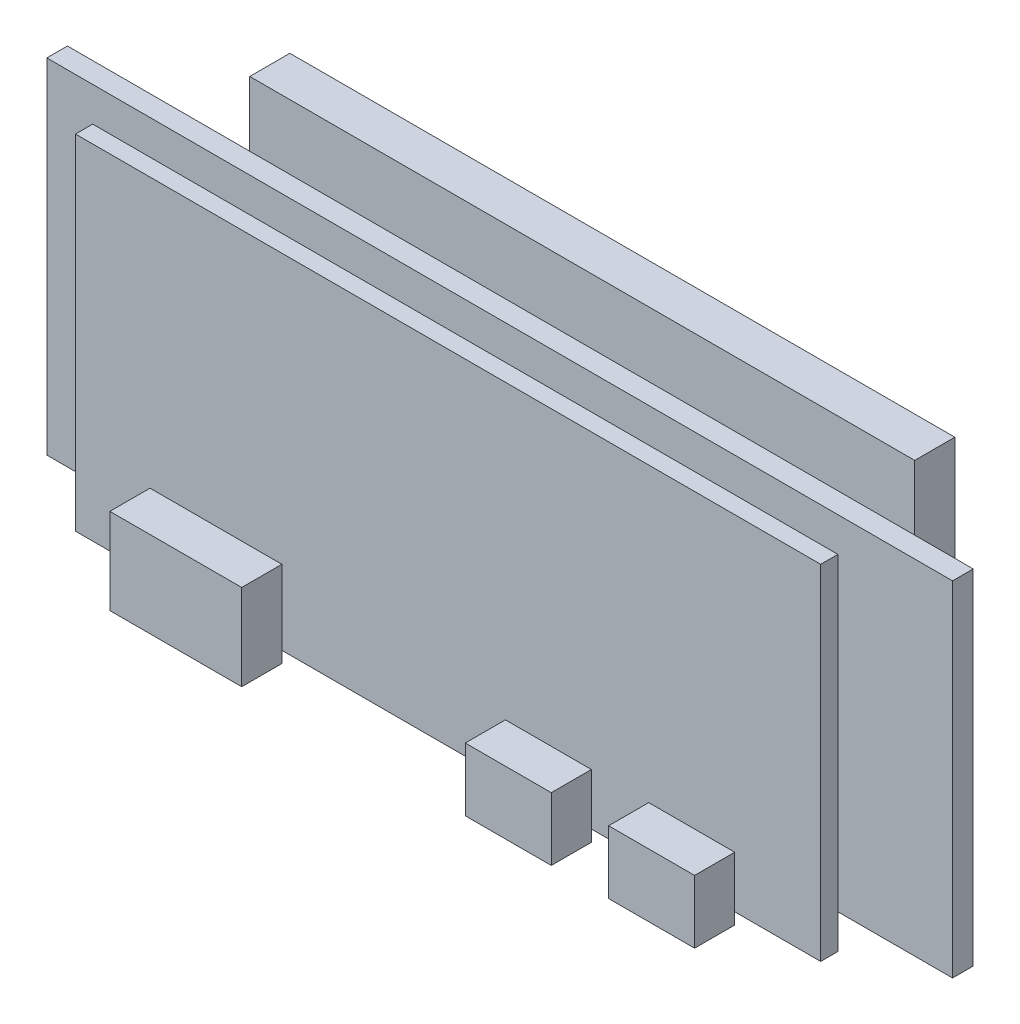
ISO-10303-21;
HEADER;
FILE_DESCRIPTION(('STEP AP214'),'2;1');
FILE_NAME('part.step','',(''),(''),'','','');
FILE_SCHEMA(('AUTOMOTIVE_DESIGN { 1 0 10303 214 1 1 1 1 }'));
ENDSEC;
DATA;
#1=APPLICATION_CONTEXT('core data for automotive mechanical design processes');
#2=APPLICATION_PROTOCOL_DEFINITION('international standard','automotive_design',2000,#1);
#3=PRODUCT_CONTEXT('',#1,'mechanical');
#4=PRODUCT('Part','Part','',(#3));
#5=PRODUCT_RELATED_PRODUCT_CATEGORY('part','',(#4));
#6=PRODUCT_DEFINITION_FORMATION('','',#4);
#7=PRODUCT_DEFINITION_CONTEXT('part definition',#1,'design');
#8=PRODUCT_DEFINITION('design','',#6,#7);
#9=PRODUCT_DEFINITION_SHAPE('','',#8);
#10=(LENGTH_UNIT() NAMED_UNIT(*) SI_UNIT(.MILLI.,.METRE.));
#11=(NAMED_UNIT(*) PLANE_ANGLE_UNIT() SI_UNIT($,.RADIAN.));
#12=(NAMED_UNIT(*) SI_UNIT($,.STERADIAN.) SOLID_ANGLE_UNIT());
#13=UNCERTAINTY_MEASURE_WITH_UNIT(LENGTH_MEASURE(1.E-05),#10,'distance_accuracy_value','');
#14=(GEOMETRIC_REPRESENTATION_CONTEXT(3) GLOBAL_UNCERTAINTY_ASSIGNED_CONTEXT((#13)) GLOBAL_UNIT_ASSIGNED_CONTEXT((#10,
#11,#12)) REPRESENTATION_CONTEXT('',''));
#15=CARTESIAN_POINT('',(0.,0.,0.));
#16=DIRECTION('',(0.,0.,1.));
#17=DIRECTION('',(1.,0.,0.));
#18=AXIS2_PLACEMENT_3D('',#15,#16,#17);
#19=CARTESIAN_POINT('',(0.,0.,15.2));
#20=DIRECTION('',(0.,0.,-1.));
#21=DIRECTION('',(-1.,0.,0.));
#22=AXIS2_PLACEMENT_3D('',#19,#20,#21);
#23=PLANE('',#22);
#24=DIRECTION('',(0.,-1.,0.));
#25=VECTOR('',#24,1.);
#26=CARTESIAN_POINT('',(5.,-10.5,15.2));
#27=LINE('',#26,#25);
#28=CARTESIAN_POINT('',(5.,-10.5,15.2));
#29=VERTEX_POINT('',#28);
#30=CARTESIAN_POINT('',(5.,-15.,15.2));
#31=VERTEX_POINT('',#30);
#32=EDGE_CURVE('E58',#29,#31,#27,.T.);
#33=ORIENTED_EDGE('',*,*,#32,.F.);
#34=DIRECTION('',(-1.,0.,0.));
#35=VECTOR('',#34,1.);
#36=CARTESIAN_POINT('',(5.,-10.5,15.2));
#37=LINE('',#36,#35);
#38=CARTESIAN_POINT('',(12.5,-10.5,15.2));
#39=VERTEX_POINT('',#38);
#40=EDGE_CURVE('E243',#39,#29,#37,.T.);
#41=ORIENTED_EDGE('',*,*,#40,.F.);
#42=DIRECTION('',(0.,1.,0.));
#43=VECTOR('',#42,1.);
#44=CARTESIAN_POINT('',(12.5,-10.5,15.2));
#45=LINE('',#44,#43);
#46=CARTESIAN_POINT('',(12.5,-15.,15.2));
#47=VERTEX_POINT('',#46);
#48=EDGE_CURVE('E890',#47,#39,#45,.T.);
#49=ORIENTED_EDGE('',*,*,#48,.F.);
#50=DIRECTION('',(-1.,0.,0.));
#51=VECTOR('',#50,1.);
#52=CARTESIAN_POINT('',(32.5,-15.,15.2));
#53=LINE('',#52,#51);
#54=CARTESIAN_POINT('',(17.5,-15.,15.2));
#55=VERTEX_POINT('',#54);
#56=EDGE_CURVE('E887',#55,#47,#53,.T.);
#57=ORIENTED_EDGE('',*,*,#56,.F.);
#58=DIRECTION('',(0.,-1.,0.));
#59=VECTOR('',#58,1.);
#60=CARTESIAN_POINT('',(17.5,-10.5,15.2));
#61=LINE('',#60,#59);
#62=CARTESIAN_POINT('',(17.5,-10.5,15.2));
#63=VERTEX_POINT('',#62);
#64=EDGE_CURVE('E66',#63,#55,#61,.T.);
#65=ORIENTED_EDGE('',*,*,#64,.F.);
#66=DIRECTION('',(-1.,0.,0.));
#67=VECTOR('',#66,1.);
#68=CARTESIAN_POINT('',(25.,-10.5,15.2));
#69=LINE('',#68,#67);
#70=CARTESIAN_POINT('',(25.,-10.5,15.2));
#71=VERTEX_POINT('',#70);
#72=EDGE_CURVE('E276',#71,#63,#69,.T.);
#73=ORIENTED_EDGE('',*,*,#72,.F.);
#74=DIRECTION('',(0.,1.,0.));
#75=VECTOR('',#74,1.);
#76=CARTESIAN_POINT('',(25.,-10.5,15.2));
#77=LINE('',#76,#75);
#78=CARTESIAN_POINT('',(25.,-15.,15.2));
#79=VERTEX_POINT('',#78);
#80=EDGE_CURVE('E249',#79,#71,#77,.T.);
#81=ORIENTED_EDGE('',*,*,#80,.F.);
#82=CARTESIAN_POINT('',(32.5,-15.,15.2));
#83=VERTEX_POINT('',#82);
#84=EDGE_CURVE('E348',#83,#79,#53,.T.);
#85=ORIENTED_EDGE('',*,*,#84,.F.);
#86=DIRECTION('',(0.,-1.,0.));
#87=VECTOR('',#86,1.);
#88=CARTESIAN_POINT('',(32.5,15.,15.2));
#89=LINE('',#88,#87);
#90=CARTESIAN_POINT('',(32.5,15.,15.2));
#91=VERTEX_POINT('',#90);
#92=EDGE_CURVE('E342',#91,#83,#89,.T.);
#93=ORIENTED_EDGE('',*,*,#92,.F.);
#94=DIRECTION('',(1.,0.,0.));
#95=VECTOR('',#94,1.);
#96=CARTESIAN_POINT('',(32.5,15.,15.2));
#97=LINE('',#96,#95);
#98=CARTESIAN_POINT('',(-32.5,15.,15.2));
#99=VERTEX_POINT('',#98);
#100=EDGE_CURVE('E359',#99,#91,#97,.T.);
#101=ORIENTED_EDGE('',*,*,#100,.F.);
#102=DIRECTION('',(0.,1.,0.));
#103=VECTOR('',#102,1.);
#104=CARTESIAN_POINT('',(-32.5,15.,15.2));
#105=LINE('',#104,#103);
#106=CARTESIAN_POINT('',(-32.5,-15.,15.2));
#107=VERTEX_POINT('',#106);
#108=EDGE_CURVE('E352',#107,#99,#105,.T.);
#109=ORIENTED_EDGE('',*,*,#108,.F.);
#110=CARTESIAN_POINT('',(-26.,-15.,15.2));
#111=VERTEX_POINT('',#110);
#112=EDGE_CURVE('E346',#111,#107,#53,.T.);
#113=ORIENTED_EDGE('',*,*,#112,.F.);
#114=DIRECTION('',(0.,-1.,0.));
#115=VECTOR('',#114,1.);
#116=CARTESIAN_POINT('',(-26.,-8.5,15.2));
#117=LINE('',#116,#115);
#118=CARTESIAN_POINT('',(-26.,-8.5,15.2));
#119=VERTEX_POINT('',#118);
#120=EDGE_CURVE('E314',#119,#111,#117,.T.);
#121=ORIENTED_EDGE('',*,*,#120,.F.);
#122=DIRECTION('',(-1.,0.,0.));
#123=VECTOR('',#122,1.);
#124=CARTESIAN_POINT('',(-26.,-8.5,15.2));
#125=LINE('',#124,#123);
#126=CARTESIAN_POINT('',(-14.5,-8.5,15.2));
#127=VERTEX_POINT('',#126);
#128=EDGE_CURVE('E304',#127,#119,#125,.T.);
#129=ORIENTED_EDGE('',*,*,#128,.F.);
#130=DIRECTION('',(0.,1.,0.));
#131=VECTOR('',#130,1.);
#132=CARTESIAN_POINT('',(-14.5,-8.5,15.2));
#133=LINE('',#132,#131);
#134=CARTESIAN_POINT('',(-14.5,-15.,15.2));
#135=VERTEX_POINT('',#134);
#136=EDGE_CURVE('E11',#135,#127,#133,.T.);
#137=ORIENTED_EDGE('',*,*,#136,.F.);
#138=EDGE_CURVE('E354',#31,#135,#53,.T.);
#139=ORIENTED_EDGE('',*,*,#138,.F.);
#140=EDGE_LOOP('',(#33,#41,#49,#57,#65,#73,#81,#85,#93,#101,#109,#113,#121,#129,#137,#139));
#141=FACE_BOUND('',#140,.T.);
#142=ADVANCED_FACE('F39',(#141),#23,.F.);
#143=CARTESIAN_POINT('',(-29.,15.25,3.5));
#144=DIRECTION('',(1.,0.,0.));
#145=DIRECTION('',(0.,0.,-1.));
#146=AXIS2_PLACEMENT_3D('',#143,#144,#145);
#147=PLANE('',#146);
#148=DIRECTION('',(0.,-1.,0.));
#149=VECTOR('',#148,1.);
#150=CARTESIAN_POINT('',(-29.,15.25,0.));
#151=LINE('',#150,#149);
#152=CARTESIAN_POINT('',(-29.,15.25,0.));
#153=VERTEX_POINT('',#152);
#154=CARTESIAN_POINT('',(-29.,-15.25,0.));
#155=VERTEX_POINT('',#154);
#156=EDGE_CURVE('E443',#153,#155,#151,.T.);
#157=ORIENTED_EDGE('',*,*,#156,.T.);
#158=DIRECTION('',(0.,0.,-1.));
#159=VECTOR('',#158,1.);
#160=CARTESIAN_POINT('',(-29.,-15.25,3.5));
#161=LINE('',#160,#159);
#162=CARTESIAN_POINT('',(-29.,-15.25,3.5));
#163=VERTEX_POINT('',#162);
#164=EDGE_CURVE('E43',#163,#155,#161,.T.);
#165=ORIENTED_EDGE('',*,*,#164,.F.);
#166=DIRECTION('',(0.,-1.,0.));
#167=VECTOR('',#166,1.);
#168=CARTESIAN_POINT('',(-29.,15.25,3.5));
#169=LINE('',#168,#167);
#170=CARTESIAN_POINT('',(-29.,15.25,3.5));
#171=VERTEX_POINT('',#170);
#172=EDGE_CURVE('E447',#171,#163,#169,.T.);
#173=ORIENTED_EDGE('',*,*,#172,.F.);
#174=DIRECTION('',(0.,0.,-1.));
#175=VECTOR('',#174,1.);
#176=CARTESIAN_POINT('',(-29.,15.25,3.5));
#177=LINE('',#176,#175);
#178=EDGE_CURVE('E461',#171,#153,#177,.T.);
#179=ORIENTED_EDGE('',*,*,#178,.T.);
#180=EDGE_LOOP('',(#157,#165,#173,#179));
#181=FACE_BOUND('',#180,.T.);
#182=ADVANCED_FACE('F41',(#181),#147,.F.);
#183=CARTESIAN_POINT('',(-29.,-15.25,3.5));
#184=DIRECTION('',(0.,1.,0.));
#185=DIRECTION('',(0.,0.,1.));
#186=AXIS2_PLACEMENT_3D('',#183,#184,#185);
#187=PLANE('',#186);
#188=DIRECTION('',(1.,0.,0.));
#189=VECTOR('',#188,1.);
#190=CARTESIAN_POINT('',(-29.,-15.25,0.));
#191=LINE('',#190,#189);
#192=CARTESIAN_POINT('',(29.,-15.25,0.));
#193=VERTEX_POINT('',#192);
#194=EDGE_CURVE('E465',#155,#193,#191,.T.);
#195=ORIENTED_EDGE('',*,*,#194,.T.);
#196=DIRECTION('',(0.,0.,-1.));
#197=VECTOR('',#196,1.);
#198=CARTESIAN_POINT('',(29.,-15.25,3.5));
#199=LINE('',#198,#197);
#200=CARTESIAN_POINT('',(29.,-15.25,3.5));
#201=VERTEX_POINT('',#200);
#202=EDGE_CURVE('E479',#201,#193,#199,.T.);
#203=ORIENTED_EDGE('',*,*,#202,.F.);
#204=DIRECTION('',(1.,0.,0.));
#205=VECTOR('',#204,1.);
#206=CARTESIAN_POINT('',(-29.,-15.25,3.5));
#207=LINE('',#206,#205);
#208=EDGE_CURVE('E451',#163,#201,#207,.T.);
#209=ORIENTED_EDGE('',*,*,#208,.F.);
#210=ORIENTED_EDGE('',*,*,#164,.T.);
#211=EDGE_LOOP('',(#195,#203,#209,#210));
#212=FACE_BOUND('',#211,.T.);
#213=ADVANCED_FACE('F490',(#212),#187,.F.);
#214=CARTESIAN_POINT('',(29.,15.25,3.5));
#215=DIRECTION('',(-1.,0.,0.));
#216=DIRECTION('',(0.,0.,1.));
#217=AXIS2_PLACEMENT_3D('',#214,#215,#216);
#218=PLANE('',#217);
#219=DIRECTION('',(0.,1.,0.));
#220=VECTOR('',#219,1.);
#221=CARTESIAN_POINT('',(29.,15.25,0.));
#222=LINE('',#221,#220);
#223=CARTESIAN_POINT('',(29.,15.25,0.));
#224=VERTEX_POINT('',#223);
#225=EDGE_CURVE('E468',#193,#224,#222,.T.);
#226=ORIENTED_EDGE('',*,*,#225,.T.);
#227=DIRECTION('',(0.,0.,-1.));
#228=VECTOR('',#227,1.);
#229=CARTESIAN_POINT('',(29.,15.25,3.5));
#230=LINE('',#229,#228);
#231=CARTESIAN_POINT('',(29.,15.25,3.5));
#232=VERTEX_POINT('',#231);
#233=EDGE_CURVE('E476',#232,#224,#230,.T.);
#234=ORIENTED_EDGE('',*,*,#233,.F.);
#235=DIRECTION('',(0.,1.,0.));
#236=VECTOR('',#235,1.);
#237=CARTESIAN_POINT('',(29.,15.25,3.5));
#238=LINE('',#237,#236);
#239=EDGE_CURVE('E455',#201,#232,#238,.T.);
#240=ORIENTED_EDGE('',*,*,#239,.F.);
#241=ORIENTED_EDGE('',*,*,#202,.T.);
#242=EDGE_LOOP('',(#226,#234,#240,#241));
#243=FACE_BOUND('',#242,.T.);
#244=ADVANCED_FACE('F499',(#243),#218,.F.);
#245=CARTESIAN_POINT('',(-29.,15.25,3.5));
#246=DIRECTION('',(0.,-1.,0.));
#247=DIRECTION('',(0.,0.,-1.));
#248=AXIS2_PLACEMENT_3D('',#245,#246,#247);
#249=PLANE('',#248);
#250=DIRECTION('',(-1.,0.,0.));
#251=VECTOR('',#250,1.);
#252=CARTESIAN_POINT('',(-29.,15.25,0.));
#253=LINE('',#252,#251);
#254=EDGE_CURVE('E452',#224,#153,#253,.T.);
#255=ORIENTED_EDGE('',*,*,#254,.T.);
#256=ORIENTED_EDGE('',*,*,#178,.F.);
#257=DIRECTION('',(-1.,0.,0.));
#258=VECTOR('',#257,1.);
#259=CARTESIAN_POINT('',(-29.,15.25,3.5));
#260=LINE('',#259,#258);
#261=EDGE_CURVE('E458',#232,#171,#260,.T.);
#262=ORIENTED_EDGE('',*,*,#261,.F.);
#263=ORIENTED_EDGE('',*,*,#233,.T.);
#264=EDGE_LOOP('',(#255,#256,#262,#263));
#265=FACE_BOUND('',#264,.T.);
#266=ADVANCED_FACE('F502',(#265),#249,.F.);
#267=CARTESIAN_POINT('',(0.,0.,3.5));
#268=DIRECTION('',(0.,0.,1.));
#269=DIRECTION('',(1.,0.,0.));
#270=AXIS2_PLACEMENT_3D('',#267,#268,#269);
#271=PLANE('',#270);
#272=CARTESIAN_POINT('',(0.,0.,3.5));
#273=DIRECTION('',(0.,0.,1.));
#274=DIRECTION('',(1.,0.,0.));
#275=AXIS2_PLACEMENT_3D('',#272,#273,#274);
#276=CIRCLE('',#275,5.07777154293215);
#277=CARTESIAN_POINT('',(5.07777154293215,0.,3.5));
#278=VERTEX_POINT('',#277);
#279=EDGE_CURVE('E49',#278,#278,#276,.T.);
#280=ORIENTED_EDGE('',*,*,#279,.F.);
#281=EDGE_LOOP('',(#280));
#282=FACE_BOUND('',#281,.T.);
#283=ORIENTED_EDGE('',*,*,#172,.T.);
#284=ORIENTED_EDGE('',*,*,#208,.T.);
#285=ORIENTED_EDGE('',*,*,#239,.T.);
#286=ORIENTED_EDGE('',*,*,#261,.T.);
#287=EDGE_LOOP('',(#283,#284,#285,#286));
#288=FACE_BOUND('',#287,.T.);
#289=ADVANCED_FACE('F504',(#282,#288),#271,.T.);
#290=CARTESIAN_POINT('',(0.,0.,0.));
#291=DIRECTION('',(0.,0.,1.));
#292=DIRECTION('',(1.,0.,0.));
#293=AXIS2_PLACEMENT_3D('',#290,#291,#292);
#294=PLANE('',#293);
#295=ORIENTED_EDGE('',*,*,#156,.F.);
#296=ORIENTED_EDGE('',*,*,#254,.F.);
#297=ORIENTED_EDGE('',*,*,#225,.F.);
#298=ORIENTED_EDGE('',*,*,#194,.F.);
#299=EDGE_LOOP('',(#295,#296,#297,#298));
#300=FACE_BOUND('',#299,.T.);
#301=ADVANCED_FACE('F497',(#300),#294,.F.);
#302=CARTESIAN_POINT('',(0.,0.,9.4));
#303=DIRECTION('',(0.,0.,-1.));
#304=DIRECTION('',(-1.,0.,0.));
#305=AXIS2_PLACEMENT_3D('',#302,#303,#304);
#306=CYLINDRICAL_SURFACE('',#305,5.07777154293215);
#307=CARTESIAN_POINT('',(0.,0.,9.4));
#308=DIRECTION('',(0.,0.,1.));
#309=DIRECTION('',(1.,0.,0.));
#310=AXIS2_PLACEMENT_3D('',#307,#308,#309);
#311=CIRCLE('',#310,5.07777154293215);
#312=CARTESIAN_POINT('',(5.07777154293215,0.,9.4));
#313=VERTEX_POINT('',#312);
#314=EDGE_CURVE('E439',#313,#313,#311,.T.);
#315=ORIENTED_EDGE('',*,*,#314,.F.);
#316=EDGE_LOOP('',(#315));
#317=FACE_BOUND('',#316,.T.);
#318=ORIENTED_EDGE('',*,*,#279,.T.);
#319=EDGE_LOOP('',(#318));
#320=FACE_BOUND('',#319,.T.);
#321=ADVANCED_FACE('F512',(#317,#320),#306,.T.);
#322=CARTESIAN_POINT('',(-39.,15.5,11.2));
#323=DIRECTION('',(1.,0.,0.));
#324=DIRECTION('',(0.,0.,-1.));
#325=AXIS2_PLACEMENT_3D('',#322,#323,#324);
#326=PLANE('',#325);
#327=DIRECTION('',(0.,-1.,0.));
#328=VECTOR('',#327,1.);
#329=CARTESIAN_POINT('',(-39.,15.5,9.4));
#330=LINE('',#329,#328);
#331=CARTESIAN_POINT('',(-39.,15.5,9.4));
#332=VERTEX_POINT('',#331);
#333=CARTESIAN_POINT('',(-39.,-14.5,9.4));
#334=VERTEX_POINT('',#333);
#335=EDGE_CURVE('E397',#332,#334,#330,.T.);
#336=ORIENTED_EDGE('',*,*,#335,.T.);
#337=DIRECTION('',(0.,0.,-1.));
#338=VECTOR('',#337,1.);
#339=CARTESIAN_POINT('',(-39.,-14.5,11.2));
#340=LINE('',#339,#338);
#341=CARTESIAN_POINT('',(-39.,-14.5,11.2));
#342=VERTEX_POINT('',#341);
#343=EDGE_CURVE('E435',#342,#334,#340,.T.);
#344=ORIENTED_EDGE('',*,*,#343,.F.);
#345=DIRECTION('',(0.,-1.,0.));
#346=VECTOR('',#345,1.);
#347=CARTESIAN_POINT('',(-39.,15.5,11.2));
#348=LINE('',#347,#346);
#349=CARTESIAN_POINT('',(-39.,15.5,11.2));
#350=VERTEX_POINT('',#349);
#351=EDGE_CURVE('E398',#350,#342,#348,.T.);
#352=ORIENTED_EDGE('',*,*,#351,.F.);
#353=DIRECTION('',(0.,0.,-1.));
#354=VECTOR('',#353,1.);
#355=CARTESIAN_POINT('',(-39.,15.5,11.2));
#356=LINE('',#355,#354);
#357=EDGE_CURVE('E412',#350,#332,#356,.T.);
#358=ORIENTED_EDGE('',*,*,#357,.T.);
#359=EDGE_LOOP('',(#336,#344,#352,#358));
#360=FACE_BOUND('',#359,.T.);
#361=ADVANCED_FACE('F570',(#360),#326,.F.);
#362=CARTESIAN_POINT('',(-39.,-14.5,11.2));
#363=DIRECTION('',(0.,1.,0.));
#364=DIRECTION('',(0.,0.,1.));
#365=AXIS2_PLACEMENT_3D('',#362,#363,#364);
#366=PLANE('',#365);
#367=DIRECTION('',(1.,0.,0.));
#368=VECTOR('',#367,1.);
#369=CARTESIAN_POINT('',(-39.,-14.5,9.4));
#370=LINE('',#369,#368);
#371=CARTESIAN_POINT('',(40.,-14.5,9.4));
#372=VERTEX_POINT('',#371);
#373=EDGE_CURVE('E416',#334,#372,#370,.T.);
#374=ORIENTED_EDGE('',*,*,#373,.T.);
#375=DIRECTION('',(0.,0.,-1.));
#376=VECTOR('',#375,1.);
#377=CARTESIAN_POINT('',(40.,-14.5,11.2));
#378=LINE('',#377,#376);
#379=CARTESIAN_POINT('',(40.,-14.5,11.2));
#380=VERTEX_POINT('',#379);
#381=EDGE_CURVE('E431',#380,#372,#378,.T.);
#382=ORIENTED_EDGE('',*,*,#381,.F.);
#383=DIRECTION('',(1.,0.,0.));
#384=VECTOR('',#383,1.);
#385=CARTESIAN_POINT('',(-39.,-14.5,11.2));
#386=LINE('',#385,#384);
#387=EDGE_CURVE('E402',#342,#380,#386,.T.);
#388=ORIENTED_EDGE('',*,*,#387,.F.);
#389=ORIENTED_EDGE('',*,*,#343,.T.);
#390=EDGE_LOOP('',(#374,#382,#388,#389));
#391=FACE_BOUND('',#390,.T.);
#392=ADVANCED_FACE('F566',(#391),#366,.F.);
#393=CARTESIAN_POINT('',(40.,15.5,11.2));
#394=DIRECTION('',(-1.,0.,0.));
#395=DIRECTION('',(0.,0.,1.));
#396=AXIS2_PLACEMENT_3D('',#393,#394,#395);
#397=PLANE('',#396);
#398=DIRECTION('',(0.,1.,0.));
#399=VECTOR('',#398,1.);
#400=CARTESIAN_POINT('',(40.,15.5,9.4));
#401=LINE('',#400,#399);
#402=CARTESIAN_POINT('',(40.,15.5,9.4));
#403=VERTEX_POINT('',#402);
#404=EDGE_CURVE('E419',#372,#403,#401,.T.);
#405=ORIENTED_EDGE('',*,*,#404,.T.);
#406=DIRECTION('',(0.,0.,-1.));
#407=VECTOR('',#406,1.);
#408=CARTESIAN_POINT('',(40.,15.5,11.2));
#409=LINE('',#408,#407);
#410=CARTESIAN_POINT('',(40.,15.5,11.2));
#411=VERTEX_POINT('',#410);
#412=EDGE_CURVE('E427',#411,#403,#409,.T.);
#413=ORIENTED_EDGE('',*,*,#412,.F.);
#414=DIRECTION('',(0.,1.,0.));
#415=VECTOR('',#414,1.);
#416=CARTESIAN_POINT('',(40.,15.5,11.2));
#417=LINE('',#416,#415);
#418=EDGE_CURVE('E406',#380,#411,#417,.T.);
#419=ORIENTED_EDGE('',*,*,#418,.F.);
#420=ORIENTED_EDGE('',*,*,#381,.T.);
#421=EDGE_LOOP('',(#405,#413,#419,#420));
#422=FACE_BOUND('',#421,.T.);
#423=ADVANCED_FACE('F562',(#422),#397,.F.);
#424=CARTESIAN_POINT('',(-39.,15.5,11.2));
#425=DIRECTION('',(0.,-1.,0.));
#426=DIRECTION('',(0.,0.,-1.));
#427=AXIS2_PLACEMENT_3D('',#424,#425,#426);
#428=PLANE('',#427);
#429=DIRECTION('',(-1.,0.,0.));
#430=VECTOR('',#429,1.);
#431=CARTESIAN_POINT('',(-39.,15.5,9.4));
#432=LINE('',#431,#430);
#433=EDGE_CURVE('E403',#403,#332,#432,.T.);
#434=ORIENTED_EDGE('',*,*,#433,.T.);
#435=ORIENTED_EDGE('',*,*,#357,.F.);
#436=DIRECTION('',(-1.,0.,0.));
#437=VECTOR('',#436,1.);
#438=CARTESIAN_POINT('',(-39.,15.5,11.2));
#439=LINE('',#438,#437);
#440=EDGE_CURVE('E409',#411,#350,#439,.T.);
#441=ORIENTED_EDGE('',*,*,#440,.F.);
#442=ORIENTED_EDGE('',*,*,#412,.T.);
#443=EDGE_LOOP('',(#434,#435,#441,#442));
#444=FACE_BOUND('',#443,.T.);
#445=ADVANCED_FACE('F555',(#444),#428,.F.);
#446=CARTESIAN_POINT('',(0.,0.,11.2));
#447=DIRECTION('',(0.,0.,1.));
#448=DIRECTION('',(1.,0.,0.));
#449=AXIS2_PLACEMENT_3D('',#446,#447,#448);
#450=PLANE('',#449);
#451=CARTESIAN_POINT('',(0.,0.,11.2));
#452=DIRECTION('',(0.,0.,-1.));
#453=DIRECTION('',(-1.,0.,0.));
#454=AXIS2_PLACEMENT_3D('',#451,#452,#453);
#455=CIRCLE('',#454,7.56900947709878);
#456=CARTESIAN_POINT('',(-7.56900947709878,0.,11.2));
#457=VERTEX_POINT('',#456);
#458=EDGE_CURVE('E393',#457,#457,#455,.T.);
#459=ORIENTED_EDGE('',*,*,#458,.T.);
#460=EDGE_LOOP('',(#459));
#461=FACE_BOUND('',#460,.T.);
#462=ORIENTED_EDGE('',*,*,#351,.T.);
#463=ORIENTED_EDGE('',*,*,#387,.T.);
#464=ORIENTED_EDGE('',*,*,#418,.T.);
#465=ORIENTED_EDGE('',*,*,#440,.T.);
#466=EDGE_LOOP('',(#462,#463,#464,#465));
#467=FACE_BOUND('',#466,.T.);
#468=ADVANCED_FACE('F552',(#461,#467),#450,.T.);
#469=CARTESIAN_POINT('',(0.,0.,9.4));
#470=DIRECTION('',(0.,0.,1.));
#471=DIRECTION('',(1.,0.,0.));
#472=AXIS2_PLACEMENT_3D('',#469,#470,#471);
#473=PLANE('',#472);
#474=ORIENTED_EDGE('',*,*,#314,.T.);
#475=EDGE_LOOP('',(#474));
#476=FACE_BOUND('',#475,.T.);
#477=ORIENTED_EDGE('',*,*,#335,.F.);
#478=ORIENTED_EDGE('',*,*,#433,.F.);
#479=ORIENTED_EDGE('',*,*,#404,.F.);
#480=ORIENTED_EDGE('',*,*,#373,.F.);
#481=EDGE_LOOP('',(#477,#478,#479,#480));
#482=FACE_BOUND('',#481,.T.);
#483=ADVANCED_FACE('F550',(#476,#482),#473,.F.);
#484=CARTESIAN_POINT('',(0.,0.,13.7));
#485=DIRECTION('',(0.,0.,-1.));
#486=DIRECTION('',(-1.,0.,0.));
#487=AXIS2_PLACEMENT_3D('',#484,#485,#486);
#488=CYLINDRICAL_SURFACE('',#487,7.56900947709878);
#489=CARTESIAN_POINT('',(0.,0.,13.7));
#490=DIRECTION('',(0.,0.,-1.));
#491=DIRECTION('',(-1.,0.,0.));
#492=AXIS2_PLACEMENT_3D('',#489,#490,#491);
#493=CIRCLE('',#492,7.56900947709878);
#494=CARTESIAN_POINT('',(-7.56900947709878,0.,13.7));
#495=VERTEX_POINT('',#494);
#496=EDGE_CURVE('E381',#495,#495,#493,.T.);
#497=ORIENTED_EDGE('',*,*,#496,.T.);
#498=EDGE_LOOP('',(#497));
#499=FACE_BOUND('',#498,.T.);
#500=ORIENTED_EDGE('',*,*,#458,.F.);
#501=EDGE_LOOP('',(#500));
#502=FACE_BOUND('',#501,.T.);
#503=ADVANCED_FACE('F546',(#499,#502),#488,.T.);
#504=CARTESIAN_POINT('',(32.5,15.,15.2));
#505=DIRECTION('',(1.,0.,0.));
#506=DIRECTION('',(0.,0.,-1.));
#507=AXIS2_PLACEMENT_3D('',#504,#505,#506);
#508=PLANE('',#507);
#509=DIRECTION('',(0.,-1.,0.));
#510=VECTOR('',#509,1.);
#511=CARTESIAN_POINT('',(32.5,15.,13.7));
#512=LINE('',#511,#510);
#513=CARTESIAN_POINT('',(32.5,15.,13.7));
#514=VERTEX_POINT('',#513);
#515=CARTESIAN_POINT('',(32.5,-15.,13.7));
#516=VERTEX_POINT('',#515);
#517=EDGE_CURVE('E341',#514,#516,#512,.T.);
#518=ORIENTED_EDGE('',*,*,#517,.F.);
#519=DIRECTION('',(0.,0.,-1.));
#520=VECTOR('',#519,1.);
#521=CARTESIAN_POINT('',(32.5,15.,15.2));
#522=LINE('',#521,#520);
#523=EDGE_CURVE('E378',#91,#514,#522,.T.);
#524=ORIENTED_EDGE('',*,*,#523,.F.);
#525=ORIENTED_EDGE('',*,*,#92,.T.);
#526=DIRECTION('',(0.,0.,-1.));
#527=VECTOR('',#526,1.);
#528=CARTESIAN_POINT('',(32.5,-15.,15.2));
#529=LINE('',#528,#527);
#530=EDGE_CURVE('E363',#83,#516,#529,.T.);
#531=ORIENTED_EDGE('',*,*,#530,.T.);
#532=EDGE_LOOP('',(#518,#524,#525,#531));
#533=FACE_BOUND('',#532,.T.);
#534=ADVANCED_FACE('F536',(#533),#508,.T.);
#535=CARTESIAN_POINT('',(32.5,15.,15.2));
#536=DIRECTION('',(0.,1.,0.));
#537=DIRECTION('',(0.,0.,1.));
#538=AXIS2_PLACEMENT_3D('',#535,#536,#537);
#539=PLANE('',#538);
#540=DIRECTION('',(1.,0.,0.));
#541=VECTOR('',#540,1.);
#542=CARTESIAN_POINT('',(32.5,15.,13.7));
#543=LINE('',#542,#541);
#544=CARTESIAN_POINT('',(-32.5,15.,13.7));
#545=VERTEX_POINT('',#544);
#546=EDGE_CURVE('E347',#545,#514,#543,.T.);
#547=ORIENTED_EDGE('',*,*,#546,.F.);
#548=DIRECTION('',(0.,0.,-1.));
#549=VECTOR('',#548,1.);
#550=CARTESIAN_POINT('',(-32.5,15.,15.2));
#551=LINE('',#550,#549);
#552=EDGE_CURVE('E382',#99,#545,#551,.T.);
#553=ORIENTED_EDGE('',*,*,#552,.F.);
#554=ORIENTED_EDGE('',*,*,#100,.T.);
#555=ORIENTED_EDGE('',*,*,#523,.T.);
#556=EDGE_LOOP('',(#547,#553,#554,#555));
#557=FACE_BOUND('',#556,.T.);
#558=ADVANCED_FACE('F532',(#557),#539,.T.);
#559=CARTESIAN_POINT('',(-32.5,15.,15.2));
#560=DIRECTION('',(-1.,0.,0.));
#561=DIRECTION('',(0.,0.,1.));
#562=AXIS2_PLACEMENT_3D('',#559,#560,#561);
#563=PLANE('',#562);
#564=DIRECTION('',(0.,1.,0.));
#565=VECTOR('',#564,1.);
#566=CARTESIAN_POINT('',(-32.5,15.,13.7));
#567=LINE('',#566,#565);
#568=CARTESIAN_POINT('',(-32.5,-15.,13.7));
#569=VERTEX_POINT('',#568);
#570=EDGE_CURVE('E371',#569,#545,#567,.T.);
#571=ORIENTED_EDGE('',*,*,#570,.F.);
#572=DIRECTION('',(0.,0.,-1.));
#573=VECTOR('',#572,1.);
#574=CARTESIAN_POINT('',(-32.5,-15.,15.2));
#575=LINE('',#574,#573);
#576=EDGE_CURVE('E385',#107,#569,#575,.T.);
#577=ORIENTED_EDGE('',*,*,#576,.F.);
#578=ORIENTED_EDGE('',*,*,#108,.T.);
#579=ORIENTED_EDGE('',*,*,#552,.T.);
#580=EDGE_LOOP('',(#571,#577,#578,#579));
#581=FACE_BOUND('',#580,.T.);
#582=ADVANCED_FACE('F535',(#581),#563,.T.);
#583=CARTESIAN_POINT('',(32.5,-15.,15.2));
#584=DIRECTION('',(0.,-1.,0.));
#585=DIRECTION('',(0.,0.,-1.));
#586=AXIS2_PLACEMENT_3D('',#583,#584,#585);
#587=PLANE('',#586);
#588=DIRECTION('',(-1.,0.,0.));
#589=VECTOR('',#588,1.);
#590=CARTESIAN_POINT('',(32.5,-15.,13.7));
#591=LINE('',#590,#589);
#592=EDGE_CURVE('E367',#516,#569,#591,.T.);
#593=ORIENTED_EDGE('',*,*,#592,.F.);
#594=ORIENTED_EDGE('',*,*,#530,.F.);
#595=ORIENTED_EDGE('',*,*,#84,.T.);
#596=EDGE_CURVE('E353',#79,#55,#53,.T.);
#597=ORIENTED_EDGE('',*,*,#596,.T.);
#598=ORIENTED_EDGE('',*,*,#56,.T.);
#599=EDGE_CURVE('E881',#47,#31,#53,.T.);
#600=ORIENTED_EDGE('',*,*,#599,.T.);
#601=ORIENTED_EDGE('',*,*,#138,.T.);
#602=EDGE_CURVE('E355',#135,#111,#53,.T.);
#603=ORIENTED_EDGE('',*,*,#602,.T.);
#604=ORIENTED_EDGE('',*,*,#112,.T.);
#605=ORIENTED_EDGE('',*,*,#576,.T.);
#606=EDGE_LOOP('',(#593,#594,#595,#597,#598,#600,#601,#603,#604,#605));
#607=FACE_BOUND('',#606,.T.);
#608=ADVANCED_FACE('F530',(#607),#587,.T.);
#609=CARTESIAN_POINT('',(0.,0.,13.7));
#610=DIRECTION('',(0.,0.,-1.));
#611=DIRECTION('',(-1.,0.,0.));
#612=AXIS2_PLACEMENT_3D('',#609,#610,#611);
#613=PLANE('',#612);
#614=ORIENTED_EDGE('',*,*,#496,.F.);
#615=EDGE_LOOP('',(#614));
#616=FACE_BOUND('',#615,.T.);
#617=ORIENTED_EDGE('',*,*,#517,.T.);
#618=ORIENTED_EDGE('',*,*,#592,.T.);
#619=ORIENTED_EDGE('',*,*,#570,.T.);
#620=ORIENTED_EDGE('',*,*,#546,.T.);
#621=EDGE_LOOP('',(#617,#618,#619,#620));
#622=FACE_BOUND('',#621,.T.);
#623=ADVANCED_FACE('F527',(#616,#622),#613,.T.);
#624=CARTESIAN_POINT('',(-26.,-8.5,18.7));
#625=DIRECTION('',(1.,0.,0.));
#626=DIRECTION('',(0.,0.,-1.));
#627=AXIS2_PLACEMENT_3D('',#624,#625,#626);
#628=PLANE('',#627);
#629=ORIENTED_EDGE('',*,*,#120,.T.);
#630=CARTESIAN_POINT('',(-26.,-16.,15.2));
#631=VERTEX_POINT('',#630);
#632=EDGE_CURVE('E298',#111,#631,#117,.T.);
#633=ORIENTED_EDGE('',*,*,#632,.T.);
#634=DIRECTION('',(0.,0.,-1.));
#635=VECTOR('',#634,1.);
#636=CARTESIAN_POINT('',(-26.,-16.,18.7));
#637=LINE('',#636,#635);
#638=CARTESIAN_POINT('',(-26.,-16.,18.7));
#639=VERTEX_POINT('',#638);
#640=EDGE_CURVE('E337',#639,#631,#637,.T.);
#641=ORIENTED_EDGE('',*,*,#640,.F.);
#642=DIRECTION('',(0.,-1.,0.));
#643=VECTOR('',#642,1.);
#644=CARTESIAN_POINT('',(-26.,-8.5,18.7));
#645=LINE('',#644,#643);
#646=CARTESIAN_POINT('',(-26.,-8.5,18.7));
#647=VERTEX_POINT('',#646);
#648=EDGE_CURVE('E299',#647,#639,#645,.T.);
#649=ORIENTED_EDGE('',*,*,#648,.F.);
#650=DIRECTION('',(0.,0.,-1.));
#651=VECTOR('',#650,1.);
#652=CARTESIAN_POINT('',(-26.,-8.5,18.7));
#653=LINE('',#652,#651);
#654=EDGE_CURVE('E313',#647,#119,#653,.T.);
#655=ORIENTED_EDGE('',*,*,#654,.T.);
#656=EDGE_LOOP('',(#629,#633,#641,#649,#655));
#657=FACE_BOUND('',#656,.T.);
#658=ADVANCED_FACE('F525',(#657),#628,.F.);
#659=CARTESIAN_POINT('',(-26.,-16.,18.7));
#660=DIRECTION('',(0.,1.,0.));
#661=DIRECTION('',(0.,0.,1.));
#662=AXIS2_PLACEMENT_3D('',#659,#660,#661);
#663=PLANE('',#662);
#664=DIRECTION('',(1.,0.,0.));
#665=VECTOR('',#664,1.);
#666=CARTESIAN_POINT('',(-26.,-16.,15.2));
#667=LINE('',#666,#665);
#668=CARTESIAN_POINT('',(-14.5,-16.,15.2));
#669=VERTEX_POINT('',#668);
#670=EDGE_CURVE('E318',#631,#669,#667,.T.);
#671=ORIENTED_EDGE('',*,*,#670,.T.);
#672=DIRECTION('',(0.,0.,-1.));
#673=VECTOR('',#672,1.);
#674=CARTESIAN_POINT('',(-14.5,-16.,18.7));
#675=LINE('',#674,#673);
#676=CARTESIAN_POINT('',(-14.5,-16.,18.7));
#677=VERTEX_POINT('',#676);
#678=EDGE_CURVE('E333',#677,#669,#675,.T.);
#679=ORIENTED_EDGE('',*,*,#678,.F.);
#680=DIRECTION('',(1.,0.,0.));
#681=VECTOR('',#680,1.);
#682=CARTESIAN_POINT('',(-26.,-16.,18.7));
#683=LINE('',#682,#681);
#684=EDGE_CURVE('E303',#639,#677,#683,.T.);
#685=ORIENTED_EDGE('',*,*,#684,.F.);
#686=ORIENTED_EDGE('',*,*,#640,.T.);
#687=EDGE_LOOP('',(#671,#679,#685,#686));
#688=FACE_BOUND('',#687,.T.);
#689=ADVANCED_FACE('F648',(#688),#663,.F.);
#690=CARTESIAN_POINT('',(-14.5,-8.5,18.7));
#691=DIRECTION('',(-1.,0.,0.));
#692=DIRECTION('',(0.,0.,1.));
#693=AXIS2_PLACEMENT_3D('',#690,#691,#692);
#694=PLANE('',#693);
#695=EDGE_CURVE('E51',#669,#135,#133,.T.);
#696=ORIENTED_EDGE('',*,*,#695,.T.);
#697=ORIENTED_EDGE('',*,*,#136,.T.);
#698=DIRECTION('',(0.,0.,-1.));
#699=VECTOR('',#698,1.);
#700=CARTESIAN_POINT('',(-14.5,-8.5,18.7));
#701=LINE('',#700,#699);
#702=CARTESIAN_POINT('',(-14.5,-8.5,18.7));
#703=VERTEX_POINT('',#702);
#704=EDGE_CURVE('E329',#703,#127,#701,.T.);
#705=ORIENTED_EDGE('',*,*,#704,.F.);
#706=DIRECTION('',(0.,1.,0.));
#707=VECTOR('',#706,1.);
#708=CARTESIAN_POINT('',(-14.5,-8.5,18.7));
#709=LINE('',#708,#707);
#710=EDGE_CURVE('E307',#677,#703,#709,.T.);
#711=ORIENTED_EDGE('',*,*,#710,.F.);
#712=ORIENTED_EDGE('',*,*,#678,.T.);
#713=EDGE_LOOP('',(#696,#697,#705,#711,#712));
#714=FACE_BOUND('',#713,.T.);
#715=ADVANCED_FACE('F655',(#714),#694,.F.);
#716=CARTESIAN_POINT('',(-26.,-8.5,18.7));
#717=DIRECTION('',(0.,-1.,0.));
#718=DIRECTION('',(0.,0.,-1.));
#719=AXIS2_PLACEMENT_3D('',#716,#717,#718);
#720=PLANE('',#719);
#721=ORIENTED_EDGE('',*,*,#128,.T.);
#722=ORIENTED_EDGE('',*,*,#654,.F.);
#723=DIRECTION('',(-1.,0.,0.));
#724=VECTOR('',#723,1.);
#725=CARTESIAN_POINT('',(-26.,-8.5,18.7));
#726=LINE('',#725,#724);
#727=EDGE_CURVE('E310',#703,#647,#726,.T.);
#728=ORIENTED_EDGE('',*,*,#727,.F.);
#729=ORIENTED_EDGE('',*,*,#704,.T.);
#730=EDGE_LOOP('',(#721,#722,#728,#729));
#731=FACE_BOUND('',#730,.T.);
#732=ADVANCED_FACE('F662',(#731),#720,.F.);
#733=CARTESIAN_POINT('',(0.,0.,18.7));
#734=DIRECTION('',(0.,0.,1.));
#735=DIRECTION('',(1.,0.,0.));
#736=AXIS2_PLACEMENT_3D('',#733,#734,#735);
#737=PLANE('',#736);
#738=ORIENTED_EDGE('',*,*,#648,.T.);
#739=ORIENTED_EDGE('',*,*,#684,.T.);
#740=ORIENTED_EDGE('',*,*,#710,.T.);
#741=ORIENTED_EDGE('',*,*,#727,.T.);
#742=EDGE_LOOP('',(#738,#739,#740,#741));
#743=FACE_BOUND('',#742,.T.);
#744=ADVANCED_FACE('F670',(#743),#737,.T.);
#745=CARTESIAN_POINT('',(0.,0.,15.2));
#746=DIRECTION('',(0.,0.,1.));
#747=DIRECTION('',(1.,0.,0.));
#748=AXIS2_PLACEMENT_3D('',#745,#746,#747);
#749=PLANE('',#748);
#750=ORIENTED_EDGE('',*,*,#602,.F.);
#751=ORIENTED_EDGE('',*,*,#695,.F.);
#752=ORIENTED_EDGE('',*,*,#670,.F.);
#753=ORIENTED_EDGE('',*,*,#632,.F.);
#754=EDGE_LOOP('',(#750,#751,#752,#753));
#755=FACE_BOUND('',#754,.T.);
#756=ADVANCED_FACE('F678',(#755),#749,.F.);
#757=CARTESIAN_POINT('',(25.,-10.5,18.7));
#758=DIRECTION('',(-1.,0.,0.));
#759=DIRECTION('',(0.,0.,1.));
#760=AXIS2_PLACEMENT_3D('',#757,#758,#759);
#761=PLANE('',#760);
#762=CARTESIAN_POINT('',(25.,-16.,15.2));
#763=VERTEX_POINT('',#762);
#764=EDGE_CURVE('E253',#763,#79,#77,.T.);
#765=ORIENTED_EDGE('',*,*,#764,.T.);
#766=ORIENTED_EDGE('',*,*,#80,.T.);
#767=DIRECTION('',(0.,0.,-1.));
#768=VECTOR('',#767,1.);
#769=CARTESIAN_POINT('',(25.,-10.5,18.7));
#770=LINE('',#769,#768);
#771=CARTESIAN_POINT('',(25.,-10.5,18.7));
#772=VERTEX_POINT('',#771);
#773=EDGE_CURVE('E294',#772,#71,#770,.T.);
#774=ORIENTED_EDGE('',*,*,#773,.F.);
#775=DIRECTION('',(0.,1.,0.));
#776=VECTOR('',#775,1.);
#777=CARTESIAN_POINT('',(25.,-10.5,18.7));
#778=LINE('',#777,#776);
#779=CARTESIAN_POINT('',(25.,-16.,18.7));
#780=VERTEX_POINT('',#779);
#781=EDGE_CURVE('E259',#780,#772,#778,.T.);
#782=ORIENTED_EDGE('',*,*,#781,.F.);
#783=DIRECTION('',(0.,0.,-1.));
#784=VECTOR('',#783,1.);
#785=CARTESIAN_POINT('',(25.,-16.,18.7));
#786=LINE('',#785,#784);
#787=EDGE_CURVE('E272',#780,#763,#786,.T.);
#788=ORIENTED_EDGE('',*,*,#787,.T.);
#789=EDGE_LOOP('',(#765,#766,#774,#782,#788));
#790=FACE_BOUND('',#789,.T.);
#791=ADVANCED_FACE('F686',(#790),#761,.F.);
#792=CARTESIAN_POINT('',(25.,-10.5,18.7));
#793=DIRECTION('',(0.,-1.,0.));
#794=DIRECTION('',(0.,0.,-1.));
#795=AXIS2_PLACEMENT_3D('',#792,#793,#794);
#796=PLANE('',#795);
#797=ORIENTED_EDGE('',*,*,#72,.T.);
#798=DIRECTION('',(0.,0.,-1.));
#799=VECTOR('',#798,1.);
#800=CARTESIAN_POINT('',(17.5,-10.5,18.7));
#801=LINE('',#800,#799);
#802=CARTESIAN_POINT('',(17.5,-10.5,18.7));
#803=VERTEX_POINT('',#802);
#804=EDGE_CURVE('E291',#803,#63,#801,.T.);
#805=ORIENTED_EDGE('',*,*,#804,.F.);
#806=DIRECTION('',(-1.,0.,0.));
#807=VECTOR('',#806,1.);
#808=CARTESIAN_POINT('',(25.,-10.5,18.7));
#809=LINE('',#808,#807);
#810=EDGE_CURVE('E263',#772,#803,#809,.T.);
#811=ORIENTED_EDGE('',*,*,#810,.F.);
#812=ORIENTED_EDGE('',*,*,#773,.T.);
#813=EDGE_LOOP('',(#797,#805,#811,#812));
#814=FACE_BOUND('',#813,.T.);
#815=ADVANCED_FACE('F694',(#814),#796,.F.);
#816=CARTESIAN_POINT('',(17.5,-10.5,18.7));
#817=DIRECTION('',(1.,0.,0.));
#818=DIRECTION('',(0.,0.,-1.));
#819=AXIS2_PLACEMENT_3D('',#816,#817,#818);
#820=PLANE('',#819);
#821=ORIENTED_EDGE('',*,*,#64,.T.);
#822=CARTESIAN_POINT('',(17.5,-16.,15.2));
#823=VERTEX_POINT('',#822);
#824=EDGE_CURVE('E279',#55,#823,#61,.T.);
#825=ORIENTED_EDGE('',*,*,#824,.T.);
#826=DIRECTION('',(0.,0.,-1.));
#827=VECTOR('',#826,1.);
#828=CARTESIAN_POINT('',(17.5,-16.,18.7));
#829=LINE('',#828,#827);
#830=CARTESIAN_POINT('',(17.5,-16.,18.7));
#831=VERTEX_POINT('',#830);
#832=EDGE_CURVE('E287',#831,#823,#829,.T.);
#833=ORIENTED_EDGE('',*,*,#832,.F.);
#834=DIRECTION('',(0.,-1.,0.));
#835=VECTOR('',#834,1.);
#836=CARTESIAN_POINT('',(17.5,-10.5,18.7));
#837=LINE('',#836,#835);
#838=EDGE_CURVE('E267',#803,#831,#837,.T.);
#839=ORIENTED_EDGE('',*,*,#838,.F.);
#840=ORIENTED_EDGE('',*,*,#804,.T.);
#841=EDGE_LOOP('',(#821,#825,#833,#839,#840));
#842=FACE_BOUND('',#841,.T.);
#843=ADVANCED_FACE('F702',(#842),#820,.F.);
#844=CARTESIAN_POINT('',(25.,-16.,18.7));
#845=DIRECTION('',(0.,1.,0.));
#846=DIRECTION('',(0.,0.,1.));
#847=AXIS2_PLACEMENT_3D('',#844,#845,#846);
#848=PLANE('',#847);
#849=DIRECTION('',(1.,0.,0.));
#850=VECTOR('',#849,1.);
#851=CARTESIAN_POINT('',(25.,-16.,15.2));
#852=LINE('',#851,#850);
#853=EDGE_CURVE('E264',#823,#763,#852,.T.);
#854=ORIENTED_EDGE('',*,*,#853,.T.);
#855=ORIENTED_EDGE('',*,*,#787,.F.);
#856=DIRECTION('',(1.,0.,0.));
#857=VECTOR('',#856,1.);
#858=CARTESIAN_POINT('',(25.,-16.,18.7));
#859=LINE('',#858,#857);
#860=EDGE_CURVE('E270',#831,#780,#859,.T.);
#861=ORIENTED_EDGE('',*,*,#860,.F.);
#862=ORIENTED_EDGE('',*,*,#832,.T.);
#863=EDGE_LOOP('',(#854,#855,#861,#862));
#864=FACE_BOUND('',#863,.T.);
#865=ADVANCED_FACE('F710',(#864),#848,.F.);
#866=CARTESIAN_POINT('',(0.,0.,18.7));
#867=DIRECTION('',(0.,0.,-1.));
#868=DIRECTION('',(-1.,0.,0.));
#869=AXIS2_PLACEMENT_3D('',#866,#867,#868);
#870=PLANE('',#869);
#871=ORIENTED_EDGE('',*,*,#781,.T.);
#872=ORIENTED_EDGE('',*,*,#810,.T.);
#873=ORIENTED_EDGE('',*,*,#838,.T.);
#874=ORIENTED_EDGE('',*,*,#860,.T.);
#875=EDGE_LOOP('',(#871,#872,#873,#874));
#876=FACE_BOUND('',#875,.T.);
#877=ADVANCED_FACE('F717',(#876),#870,.F.);
#878=CARTESIAN_POINT('',(0.,0.,15.2));
#879=DIRECTION('',(0.,0.,-1.));
#880=DIRECTION('',(-1.,0.,0.));
#881=AXIS2_PLACEMENT_3D('',#878,#879,#880);
#882=PLANE('',#881);
#883=ORIENTED_EDGE('',*,*,#824,.F.);
#884=ORIENTED_EDGE('',*,*,#596,.F.);
#885=ORIENTED_EDGE('',*,*,#764,.F.);
#886=ORIENTED_EDGE('',*,*,#853,.F.);
#887=EDGE_LOOP('',(#883,#884,#885,#886));
#888=FACE_BOUND('',#887,.T.);
#889=ADVANCED_FACE('F725',(#888),#882,.T.);
#890=CARTESIAN_POINT('',(5.,-10.5,18.7));
#891=DIRECTION('',(1.,0.,0.));
#892=DIRECTION('',(0.,0.,-1.));
#893=AXIS2_PLACEMENT_3D('',#890,#891,#892);
#894=PLANE('',#893);
#895=ORIENTED_EDGE('',*,*,#32,.T.);
#896=CARTESIAN_POINT('',(5.,-16.,15.2));
#897=VERTEX_POINT('',#896);
#898=EDGE_CURVE('E246',#31,#897,#27,.T.);
#899=ORIENTED_EDGE('',*,*,#898,.T.);
#900=DIRECTION('',(0.,0.,-1.));
#901=VECTOR('',#900,1.);
#902=CARTESIAN_POINT('',(5.,-16.,18.7));
#903=LINE('',#902,#901);
#904=CARTESIAN_POINT('',(5.,-16.,18.7));
#905=VERTEX_POINT('',#904);
#906=EDGE_CURVE('E228',#905,#897,#903,.T.);
#907=ORIENTED_EDGE('',*,*,#906,.F.);
#908=DIRECTION('',(0.,-1.,0.));
#909=VECTOR('',#908,1.);
#910=CARTESIAN_POINT('',(5.,-10.5,18.7));
#911=LINE('',#910,#909);
#912=CARTESIAN_POINT('',(5.,-10.5,18.7));
#913=VERTEX_POINT('',#912);
#914=EDGE_CURVE('E235',#913,#905,#911,.T.);
#915=ORIENTED_EDGE('',*,*,#914,.F.);
#916=DIRECTION('',(0.,0.,-1.));
#917=VECTOR('',#916,1.);
#918=CARTESIAN_POINT('',(5.,-10.5,18.7));
#919=LINE('',#918,#917);
#920=EDGE_CURVE('E950',#913,#29,#919,.T.);
#921=ORIENTED_EDGE('',*,*,#920,.T.);
#922=EDGE_LOOP('',(#895,#899,#907,#915,#921));
#923=FACE_BOUND('',#922,.T.);
#924=ADVANCED_FACE('F245',(#923),#894,.F.);
#925=CARTESIAN_POINT('',(5.,-16.,18.7));
#926=DIRECTION('',(0.,1.,0.));
#927=DIRECTION('',(0.,0.,1.));
#928=AXIS2_PLACEMENT_3D('',#925,#926,#927);
#929=PLANE('',#928);
#930=DIRECTION('',(1.,0.,0.));
#931=VECTOR('',#930,1.);
#932=CARTESIAN_POINT('',(5.,-16.,15.2));
#933=LINE('',#932,#931);
#934=CARTESIAN_POINT('',(12.5,-16.,15.2));
#935=VERTEX_POINT('',#934);
#936=EDGE_CURVE('E898',#897,#935,#933,.T.);
#937=ORIENTED_EDGE('',*,*,#936,.T.);
#938=DIRECTION('',(0.,0.,-1.));
#939=VECTOR('',#938,1.);
#940=CARTESIAN_POINT('',(12.5,-16.,18.7));
#941=LINE('',#940,#939);
#942=CARTESIAN_POINT('',(12.5,-16.,18.7));
#943=VERTEX_POINT('',#942);
#944=EDGE_CURVE('E230',#943,#935,#941,.T.);
#945=ORIENTED_EDGE('',*,*,#944,.F.);
#946=DIRECTION('',(1.,0.,0.));
#947=VECTOR('',#946,1.);
#948=CARTESIAN_POINT('',(5.,-16.,18.7));
#949=LINE('',#948,#947);
#950=EDGE_CURVE('E224',#905,#943,#949,.T.);
#951=ORIENTED_EDGE('',*,*,#950,.F.);
#952=ORIENTED_EDGE('',*,*,#906,.T.);
#953=EDGE_LOOP('',(#937,#945,#951,#952));
#954=FACE_BOUND('',#953,.T.);
#955=ADVANCED_FACE('F226',(#954),#929,.F.);
#956=CARTESIAN_POINT('',(12.5,-10.5,18.7));
#957=DIRECTION('',(-1.,0.,0.));
#958=DIRECTION('',(0.,0.,1.));
#959=AXIS2_PLACEMENT_3D('',#956,#957,#958);
#960=PLANE('',#959);
#961=EDGE_CURVE('E883',#935,#47,#45,.T.);
#962=ORIENTED_EDGE('',*,*,#961,.T.);
#963=ORIENTED_EDGE('',*,*,#48,.T.);
#964=DIRECTION('',(0.,0.,-1.));
#965=VECTOR('',#964,1.);
#966=CARTESIAN_POINT('',(12.5,-10.5,18.7));
#967=LINE('',#966,#965);
#968=CARTESIAN_POINT('',(12.5,-10.5,18.7));
#969=VERTEX_POINT('',#968);
#970=EDGE_CURVE('E255',#969,#39,#967,.T.);
#971=ORIENTED_EDGE('',*,*,#970,.F.);
#972=DIRECTION('',(0.,1.,0.));
#973=VECTOR('',#972,1.);
#974=CARTESIAN_POINT('',(12.5,-10.5,18.7));
#975=LINE('',#974,#973);
#976=EDGE_CURVE('E234',#943,#969,#975,.T.);
#977=ORIENTED_EDGE('',*,*,#976,.F.);
#978=ORIENTED_EDGE('',*,*,#944,.T.);
#979=EDGE_LOOP('',(#962,#963,#971,#977,#978));
#980=FACE_BOUND('',#979,.T.);
#981=ADVANCED_FACE('F746',(#980),#960,.F.);
#982=CARTESIAN_POINT('',(5.,-10.5,18.7));
#983=DIRECTION('',(0.,-1.,0.));
#984=DIRECTION('',(0.,0.,-1.));
#985=AXIS2_PLACEMENT_3D('',#982,#983,#984);
#986=PLANE('',#985);
#987=ORIENTED_EDGE('',*,*,#40,.T.);
#988=ORIENTED_EDGE('',*,*,#920,.F.);
#989=DIRECTION('',(-1.,0.,0.));
#990=VECTOR('',#989,1.);
#991=CARTESIAN_POINT('',(5.,-10.5,18.7));
#992=LINE('',#991,#990);
#993=EDGE_CURVE('E240',#969,#913,#992,.T.);
#994=ORIENTED_EDGE('',*,*,#993,.F.);
#995=ORIENTED_EDGE('',*,*,#970,.T.);
#996=EDGE_LOOP('',(#987,#988,#994,#995));
#997=FACE_BOUND('',#996,.T.);
#998=ADVANCED_FACE('F753',(#997),#986,.F.);
#999=CARTESIAN_POINT('',(0.,0.,18.7));
#1000=DIRECTION('',(0.,0.,1.));
#1001=DIRECTION('',(1.,0.,0.));
#1002=AXIS2_PLACEMENT_3D('',#999,#1000,#1001);
#1003=PLANE('',#1002);
#1004=ORIENTED_EDGE('',*,*,#914,.T.);
#1005=ORIENTED_EDGE('',*,*,#950,.T.);
#1006=ORIENTED_EDGE('',*,*,#976,.T.);
#1007=ORIENTED_EDGE('',*,*,#993,.T.);
#1008=EDGE_LOOP('',(#1004,#1005,#1006,#1007));
#1009=FACE_BOUND('',#1008,.T.);
#1010=ADVANCED_FACE('F238',(#1009),#1003,.T.);
#1011=CARTESIAN_POINT('',(0.,0.,15.2));
#1012=DIRECTION('',(0.,0.,1.));
#1013=DIRECTION('',(1.,0.,0.));
#1014=AXIS2_PLACEMENT_3D('',#1011,#1012,#1013);
#1015=PLANE('',#1014);
#1016=ORIENTED_EDGE('',*,*,#599,.F.);
#1017=ORIENTED_EDGE('',*,*,#961,.F.);
#1018=ORIENTED_EDGE('',*,*,#936,.F.);
#1019=ORIENTED_EDGE('',*,*,#898,.F.);
#1020=EDGE_LOOP('',(#1016,#1017,#1018,#1019));
#1021=FACE_BOUND('',#1020,.T.);
#1022=ADVANCED_FACE('F768',(#1021),#1015,.F.);
#1023=CLOSED_SHELL('',(#142,#182,#213,#244,#266,#289,#301,#321,#361,#392,#423,#445,#468,#483,
#503,#534,#558,#582,#608,#623,#658,#689,#715,#732,#744,#756,#791,#815,#843,#865,#877,#889,#924,
#955,#981,#998,#1010,#1022));
#1024=MANIFOLD_SOLID_BREP('B2',#1023);
#1025=ADVANCED_BREP_SHAPE_REPRESENTATION('',(#18,#1024),#14);
#1026=SHAPE_DEFINITION_REPRESENTATION(#9,#1025);
ENDSEC;
END-ISO-10303-21;
